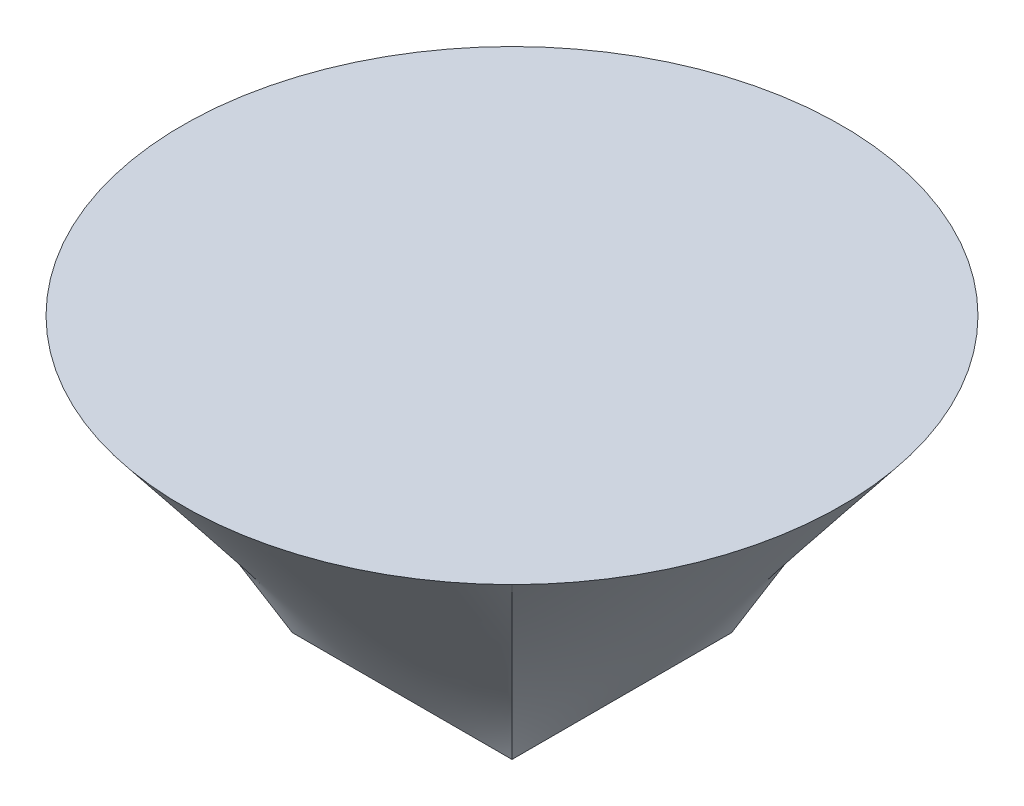
ISO-10303-21;
HEADER;
FILE_DESCRIPTION(('STEP AP214'),'2;1');
FILE_NAME('part.step','',(''),(''),'','','');
FILE_SCHEMA(('AUTOMOTIVE_DESIGN { 1 0 10303 214 1 1 1 1 }'));
ENDSEC;
DATA;
#1=APPLICATION_CONTEXT('core data for automotive mechanical design processes');
#2=APPLICATION_PROTOCOL_DEFINITION('international standard','automotive_design',2000,#1);
#3=PRODUCT_CONTEXT('',#1,'mechanical');
#4=PRODUCT('Part','Part','',(#3));
#5=PRODUCT_RELATED_PRODUCT_CATEGORY('part','',(#4));
#6=PRODUCT_DEFINITION_FORMATION('','',#4);
#7=PRODUCT_DEFINITION_CONTEXT('part definition',#1,'design');
#8=PRODUCT_DEFINITION('design','',#6,#7);
#9=PRODUCT_DEFINITION_SHAPE('','',#8);
#10=(LENGTH_UNIT() NAMED_UNIT(*) SI_UNIT(.MILLI.,.METRE.));
#11=(NAMED_UNIT(*) PLANE_ANGLE_UNIT() SI_UNIT($,.RADIAN.));
#12=(NAMED_UNIT(*) SI_UNIT($,.STERADIAN.) SOLID_ANGLE_UNIT());
#13=UNCERTAINTY_MEASURE_WITH_UNIT(LENGTH_MEASURE(1.E-05),#10,'distance_accuracy_value','');
#14=(GEOMETRIC_REPRESENTATION_CONTEXT(3) GLOBAL_UNCERTAINTY_ASSIGNED_CONTEXT((#13)) GLOBAL_UNIT_ASSIGNED_CONTEXT((#10,
#11,#12)) REPRESENTATION_CONTEXT('',''));
#15=CARTESIAN_POINT('',(0.,0.,0.));
#16=DIRECTION('',(0.,0.,1.));
#17=DIRECTION('',(1.,0.,0.));
#18=AXIS2_PLACEMENT_3D('',#15,#16,#17);
#19=CARTESIAN_POINT('',(0.,50.,0.));
#20=DIRECTION('',(0.,1.,0.));
#21=DIRECTION('',(0.,0.,1.));
#22=AXIS2_PLACEMENT_3D('',#19,#20,#21);
#23=PLANE('',#22);
#24=CARTESIAN_POINT('',(0.,50.,0.));
#25=DIRECTION('',(0.,1.,0.));
#26=DIRECTION('',(0.,0.,1.));
#27=AXIS2_PLACEMENT_3D('',#24,#25,#26);
#28=CIRCLE('',#27,60.);
#29=CARTESIAN_POINT('',(-42.4264068711928,50.,-42.4264068711929));
#30=VERTEX_POINT('',#29);
#31=CARTESIAN_POINT('',(-42.4264068711929,50.,42.4264068711928));
#32=VERTEX_POINT('',#31);
#33=EDGE_CURVE('E12',#30,#32,#28,.T.);
#34=ORIENTED_EDGE('',*,*,#33,.T.);
#35=CARTESIAN_POINT('',(42.4264068711929,50.,42.4264068711929));
#36=VERTEX_POINT('',#35);
#37=EDGE_CURVE('E81',#32,#36,#28,.T.);
#38=ORIENTED_EDGE('',*,*,#37,.T.);
#39=CARTESIAN_POINT('',(42.4264068711929,50.,-42.4264068711929));
#40=VERTEX_POINT('',#39);
#41=EDGE_CURVE('E147',#36,#40,#28,.T.);
#42=ORIENTED_EDGE('',*,*,#41,.T.);
#43=EDGE_CURVE('E145',#40,#30,#28,.T.);
#44=ORIENTED_EDGE('',*,*,#43,.T.);
#45=EDGE_LOOP('',(#34,#38,#42,#44));
#46=FACE_BOUND('',#45,.T.);
#47=ADVANCED_FACE('F71',(#46),#23,.T.);
#48=CARTESIAN_POINT('',(0.,0.,0.));
#49=DIRECTION('',(0.,-1.,0.));
#50=DIRECTION('',(0.,0.,-1.));
#51=AXIS2_PLACEMENT_3D('',#48,#49,#50);
#52=PLANE('',#51);
#53=DIRECTION('',(0.,0.,-1.));
#54=VECTOR('',#53,1.);
#55=CARTESIAN_POINT('',(20.,0.,20.));
#56=LINE('',#55,#54);
#57=CARTESIAN_POINT('',(20.,0.,20.));
#58=VERTEX_POINT('',#57);
#59=CARTESIAN_POINT('',(20.,0.,-20.));
#60=VERTEX_POINT('',#59);
#61=EDGE_CURVE('E139',#58,#60,#56,.T.);
#62=ORIENTED_EDGE('',*,*,#61,.F.);
#63=DIRECTION('',(1.,0.,0.));
#64=VECTOR('',#63,1.);
#65=CARTESIAN_POINT('',(-20.,0.,20.));
#66=LINE('',#65,#64);
#67=CARTESIAN_POINT('',(-20.,0.,20.));
#68=VERTEX_POINT('',#67);
#69=EDGE_CURVE('E121',#68,#58,#66,.T.);
#70=ORIENTED_EDGE('',*,*,#69,.F.);
#71=DIRECTION('',(0.,0.,1.));
#72=VECTOR('',#71,1.);
#73=CARTESIAN_POINT('',(-20.,0.,20.));
#74=LINE('',#73,#72);
#75=CARTESIAN_POINT('',(-20.,0.,-20.));
#76=VERTEX_POINT('',#75);
#77=EDGE_CURVE('E112',#76,#68,#74,.T.);
#78=ORIENTED_EDGE('',*,*,#77,.F.);
#79=DIRECTION('',(-1.,0.,0.));
#80=VECTOR('',#79,1.);
#81=CARTESIAN_POINT('',(-20.,0.,-20.));
#82=LINE('',#81,#80);
#83=EDGE_CURVE('E117',#60,#76,#82,.T.);
#84=ORIENTED_EDGE('',*,*,#83,.F.);
#85=EDGE_LOOP('',(#62,#70,#78,#84));
#86=FACE_BOUND('',#85,.T.);
#87=ADVANCED_FACE('F116',(#86),#52,.T.);
#88=CARTESIAN_POINT('',(-20.,0.,20.));
#89=CARTESIAN_POINT('',(-42.4264068711929,50.,42.4264068711928));
#90=CARTESIAN_POINT('',(-18.3333333333333,0.,20.));
#91=CARTESIAN_POINT('',(-39.9264068711929,50.,44.9264068711928));
#92=CARTESIAN_POINT('',(-16.6666666666667,0.,20.));
#93=CARTESIAN_POINT('',(-37.1106714589536,50.,47.2976537781671));
#94=CARTESIAN_POINT('',(-13.3333333333333,0.,20.));
#95=CARTESIAN_POINT('',(-30.8854788248622,50.,51.5786504942961));
#96=CARTESIAN_POINT('',(-11.6666666666667,0.,20.));
#97=CARTESIAN_POINT('',(-27.4757036978699,50.,53.4870142262914));
#98=CARTESIAN_POINT('',(-8.33333333333336,0.,20.));
#99=CARTESIAN_POINT('',(-20.1855780020187,50.,56.6420111336194));
#100=CARTESIAN_POINT('',(-6.66666666666669,0.,20.));
#101=CARTESIAN_POINT('',(-16.3057981833248,50.,57.8870978948963));
#102=CARTESIAN_POINT('',(-3.33333333333336,0.,20.));
#103=CARTESIAN_POINT('',(-8.28333875131798,50.,59.5666136037591));
#104=CARTESIAN_POINT('',(-1.66666666666669,0.,20.));
#105=CARTESIAN_POINT('',(-4.14213562373096,50.,60.));
#106=CARTESIAN_POINT('',(1.66666666666664,0.,20.));
#107=CARTESIAN_POINT('',(4.14213562373094,50.,60.));
#108=CARTESIAN_POINT('',(3.33333333333331,0.,20.));
#109=CARTESIAN_POINT('',(8.28333875131797,50.,59.5666136037591));
#110=CARTESIAN_POINT('',(6.66666666666664,0.,20.));
#111=CARTESIAN_POINT('',(16.3057981833248,50.,57.8870978948963));
#112=CARTESIAN_POINT('',(8.33333333333331,0.,20.));
#113=CARTESIAN_POINT('',(20.1855780020186,50.,56.6420111336194));
#114=CARTESIAN_POINT('',(11.6666666666666,0.,20.));
#115=CARTESIAN_POINT('',(27.4757036978699,50.,53.4870142262914));
#116=CARTESIAN_POINT('',(13.3333333333333,0.,20.));
#117=CARTESIAN_POINT('',(30.8854788248622,50.,51.5786504942961));
#118=CARTESIAN_POINT('',(16.6666666666667,0.,20.));
#119=CARTESIAN_POINT('',(37.1106714589536,50.,47.2976537781671));
#120=CARTESIAN_POINT('',(18.3333333333333,0.,20.));
#121=CARTESIAN_POINT('',(39.9264068711929,50.,44.9264068711929));
#122=CARTESIAN_POINT('',(20.,0.,20.));
#123=CARTESIAN_POINT('',(42.4264068711929,50.,42.4264068711929));
#124=B_SPLINE_SURFACE_WITH_KNOTS('',3,1,((#88,#89),(#90,#91),(#92,#93),(#94,#95),(#96,#97),(#98,
#99),(#100,#101),(#102,#103),(#104,#105),(#106,#107),(#108,#109),(#110,#111),(#112,#113),(#114,
#115),(#116,#117),(#118,#119),(#120,#121),(#122,#123)),.UNSPECIFIED.,.F.,.F.,.F.,(4,2,2,2,2,2,2,
2,4),(2,2),(0.,0.125,0.25,0.375,0.5,0.625,0.75,0.875,1.),(0.,1.),.UNSPECIFIED.);
#125=DIRECTION('',(0.378757038526448,0.844444321156433,0.378757038526448));
#126=VECTOR('',#125,1.);
#127=CARTESIAN_POINT('',(31.2132034355964,25.,31.2132034355964));
#128=LINE('',#127,#126);
#129=EDGE_CURVE('E149',#58,#36,#128,.T.);
#130=DIRECTION('',(0.378757038526448,-0.844444321156433,-0.378757038526448));
#131=VECTOR('',#130,1.);
#132=CARTESIAN_POINT('',(-31.2132034355964,25.,31.2132034355964));
#133=LINE('',#132,#131);
#134=EDGE_CURVE('E244',#32,#68,#133,.T.);
#135=ORIENTED_EDGE('',*,*,#69,.T.);
#136=ORIENTED_EDGE('',*,*,#129,.T.);
#137=ORIENTED_EDGE('',*,*,#37,.F.);
#138=ORIENTED_EDGE('',*,*,#134,.T.);
#139=EDGE_LOOP('',(#135,#136,#137,#138));
#140=FACE_BOUND('',#139,.T.);
#141=ADVANCED_FACE('F251',(#140),#124,.T.);
#142=CARTESIAN_POINT('',(20.,0.,20.));
#143=CARTESIAN_POINT('',(42.4264068711929,50.,42.4264068711929));
#144=CARTESIAN_POINT('',(20.,0.,18.3333333333333));
#145=CARTESIAN_POINT('',(44.9264068711929,50.,39.9264068711929));
#146=CARTESIAN_POINT('',(20.,0.,16.6666666666667));
#147=CARTESIAN_POINT('',(47.2976537781672,50.,37.1106714589536));
#148=CARTESIAN_POINT('',(20.,0.,13.3333333333333));
#149=CARTESIAN_POINT('',(51.5786504942961,50.,30.8854788248622));
#150=CARTESIAN_POINT('',(20.,0.,11.6666666666667));
#151=CARTESIAN_POINT('',(53.4870142262914,50.,27.4757036978699));
#152=CARTESIAN_POINT('',(20.,0.,8.33333333333334));
#153=CARTESIAN_POINT('',(56.6420111336194,50.,20.1855780020186));
#154=CARTESIAN_POINT('',(20.,0.,6.66666666666667));
#155=CARTESIAN_POINT('',(57.8870978948963,50.,16.3057981833248));
#156=CARTESIAN_POINT('',(20.,0.,3.33333333333334));
#157=CARTESIAN_POINT('',(59.5666136037591,50.,8.28333875131798));
#158=CARTESIAN_POINT('',(20.,0.,1.66666666666667));
#159=CARTESIAN_POINT('',(60.,50.,4.14213562373095));
#160=CARTESIAN_POINT('',(20.,0.,-1.66666666666666));
#161=CARTESIAN_POINT('',(60.,50.,-4.14213562373095));
#162=CARTESIAN_POINT('',(20.,0.,-3.33333333333333));
#163=CARTESIAN_POINT('',(59.5666136037591,50.,-8.28333875131797));
#164=CARTESIAN_POINT('',(20.,0.,-6.66666666666666));
#165=CARTESIAN_POINT('',(57.8870978948963,50.,-16.3057981833248));
#166=CARTESIAN_POINT('',(20.,0.,-8.33333333333333));
#167=CARTESIAN_POINT('',(56.6420111336194,50.,-20.1855780020186));
#168=CARTESIAN_POINT('',(20.,0.,-11.6666666666667));
#169=CARTESIAN_POINT('',(53.4870142262914,50.,-27.4757036978699));
#170=CARTESIAN_POINT('',(20.,0.,-13.3333333333333));
#171=CARTESIAN_POINT('',(51.5786504942961,50.,-30.8854788248622));
#172=CARTESIAN_POINT('',(20.,0.,-16.6666666666667));
#173=CARTESIAN_POINT('',(47.2976537781672,50.,-37.1106714589536));
#174=CARTESIAN_POINT('',(20.,0.,-18.3333333333333));
#175=CARTESIAN_POINT('',(44.9264068711929,50.,-39.9264068711929));
#176=CARTESIAN_POINT('',(20.,0.,-20.));
#177=CARTESIAN_POINT('',(42.4264068711929,50.,-42.4264068711929));
#178=B_SPLINE_SURFACE_WITH_KNOTS('',3,1,((#142,#143),(#144,#145),(#146,#147),(#148,#149),(#150,
#151),(#152,#153),(#154,#155),(#156,#157),(#158,#159),(#160,#161),(#162,#163),(#164,#165),(#166,
#167),(#168,#169),(#170,#171),(#172,#173),(#174,#175),(#176,#177)),.UNSPECIFIED.,.F.,.F.,.F.,(4,
2,2,2,2,2,2,2,4),(2,2),(0.,0.125,0.25,0.375,0.5,0.625,0.75,0.875,1.),(0.,1.),.UNSPECIFIED.);
#179=DIRECTION('',(0.378757038526448,0.844444321156433,-0.378757038526448));
#180=VECTOR('',#179,1.);
#181=CARTESIAN_POINT('',(31.2132034355964,25.,-31.2132034355964));
#182=LINE('',#181,#180);
#183=EDGE_CURVE('E138',#60,#40,#182,.T.);
#184=ORIENTED_EDGE('',*,*,#61,.T.);
#185=ORIENTED_EDGE('',*,*,#183,.T.);
#186=ORIENTED_EDGE('',*,*,#41,.F.);
#187=ORIENTED_EDGE('',*,*,#129,.F.);
#188=EDGE_LOOP('',(#184,#185,#186,#187));
#189=FACE_BOUND('',#188,.T.);
#190=ADVANCED_FACE('F171',(#189),#178,.T.);
#191=CARTESIAN_POINT('',(-20.,0.,-20.));
#192=CARTESIAN_POINT('',(-42.4264068711929,50.,-42.4264068711929));
#193=CARTESIAN_POINT('',(-20.,0.,-18.3333333333333));
#194=CARTESIAN_POINT('',(-44.9264068711929,50.,-39.9264068711929));
#195=CARTESIAN_POINT('',(-20.,0.,-16.6666666666667));
#196=CARTESIAN_POINT('',(-47.2976537781672,50.,-37.1106714589537));
#197=CARTESIAN_POINT('',(-20.,0.,-13.3333333333333));
#198=CARTESIAN_POINT('',(-51.5786504942961,50.,-30.8854788248622));
#199=CARTESIAN_POINT('',(-20.,0.,-11.6666666666666));
#200=CARTESIAN_POINT('',(-53.4870142262914,50.,-27.4757036978699));
#201=CARTESIAN_POINT('',(-20.,0.,-8.3333333333333));
#202=CARTESIAN_POINT('',(-56.6420111336194,50.,-20.1855780020187));
#203=CARTESIAN_POINT('',(-20.,0.,-6.66666666666663));
#204=CARTESIAN_POINT('',(-57.8870978948963,50.,-16.3057981833248));
#205=CARTESIAN_POINT('',(-20.,0.,-3.3333333333333));
#206=CARTESIAN_POINT('',(-59.5666136037591,50.,-8.28333875131799));
#207=CARTESIAN_POINT('',(-20.,0.,-1.66666666666663));
#208=CARTESIAN_POINT('',(-60.,50.,-4.14213562373096));
#209=CARTESIAN_POINT('',(-20.,0.,1.6666666666667));
#210=CARTESIAN_POINT('',(-60.,50.,4.14213562373094));
#211=CARTESIAN_POINT('',(-20.,0.,3.33333333333337));
#212=CARTESIAN_POINT('',(-59.5666136037591,50.,8.28333875131796));
#213=CARTESIAN_POINT('',(-20.,0.,6.66666666666671));
#214=CARTESIAN_POINT('',(-57.8870978948963,50.,16.3057981833248));
#215=CARTESIAN_POINT('',(-20.,0.,8.33333333333337));
#216=CARTESIAN_POINT('',(-56.6420111336194,50.,20.1855780020186));
#217=CARTESIAN_POINT('',(-20.,0.,11.6666666666667));
#218=CARTESIAN_POINT('',(-53.4870142262914,50.,27.4757036978698));
#219=CARTESIAN_POINT('',(-20.,0.,13.3333333333334));
#220=CARTESIAN_POINT('',(-51.5786504942961,50.,30.8854788248622));
#221=CARTESIAN_POINT('',(-20.,0.,16.6666666666667));
#222=CARTESIAN_POINT('',(-47.2976537781672,50.,37.1106714589536));
#223=CARTESIAN_POINT('',(-20.,0.,18.3333333333333));
#224=CARTESIAN_POINT('',(-44.9264068711929,50.,39.9264068711929));
#225=CARTESIAN_POINT('',(-20.,0.,20.));
#226=CARTESIAN_POINT('',(-42.4264068711929,50.,42.4264068711929));
#227=B_SPLINE_SURFACE_WITH_KNOTS('',3,1,((#191,#192),(#193,#194),(#195,#196),(#197,#198),(#199,
#200),(#201,#202),(#203,#204),(#205,#206),(#207,#208),(#209,#210),(#211,#212),(#213,#214),(#215,
#216),(#217,#218),(#219,#220),(#221,#222),(#223,#224),(#225,#226)),.UNSPECIFIED.,.F.,.F.,.F.,(4,
2,2,2,2,2,2,2,4),(2,2),(0.,0.125,0.25,0.375,0.5,0.625,0.75,0.875,1.),(0.,1.),.UNSPECIFIED.);
#228=DIRECTION('',(-0.378757038526448,0.844444321156433,-0.378757038526449));
#229=VECTOR('',#228,1.);
#230=CARTESIAN_POINT('',(-31.2132034355964,25.,-31.2132034355964));
#231=LINE('',#230,#229);
#232=EDGE_CURVE('E136',#76,#30,#231,.T.);
#233=ORIENTED_EDGE('',*,*,#77,.T.);
#234=ORIENTED_EDGE('',*,*,#134,.F.);
#235=ORIENTED_EDGE('',*,*,#33,.F.);
#236=ORIENTED_EDGE('',*,*,#232,.F.);
#237=EDGE_LOOP('',(#233,#234,#235,#236));
#238=FACE_BOUND('',#237,.T.);
#239=ADVANCED_FACE('F143',(#238),#227,.T.);
#240=CARTESIAN_POINT('',(20.,0.,-20.));
#241=CARTESIAN_POINT('',(42.4264068711929,50.,-42.4264068711929));
#242=CARTESIAN_POINT('',(18.3333333333333,0.,-20.));
#243=CARTESIAN_POINT('',(39.9264068711929,50.,-44.9264068711928));
#244=CARTESIAN_POINT('',(16.6666666666667,0.,-20.));
#245=CARTESIAN_POINT('',(37.1106714589536,50.,-47.2976537781671));
#246=CARTESIAN_POINT('',(13.3333333333333,0.,-20.));
#247=CARTESIAN_POINT('',(30.8854788248622,50.,-51.5786504942961));
#248=CARTESIAN_POINT('',(11.6666666666666,0.,-20.));
#249=CARTESIAN_POINT('',(27.4757036978699,50.,-53.4870142262914));
#250=CARTESIAN_POINT('',(8.33333333333331,0.,-20.));
#251=CARTESIAN_POINT('',(20.1855780020186,50.,-56.6420111336194));
#252=CARTESIAN_POINT('',(6.66666666666664,0.,-20.));
#253=CARTESIAN_POINT('',(16.3057981833248,50.,-57.8870978948963));
#254=CARTESIAN_POINT('',(3.33333333333331,0.,-20.));
#255=CARTESIAN_POINT('',(8.28333875131798,50.,-59.5666136037591));
#256=CARTESIAN_POINT('',(1.66666666666665,0.,-20.));
#257=CARTESIAN_POINT('',(4.14213562373096,50.,-60.));
#258=CARTESIAN_POINT('',(-1.66666666666669,0.,-20.));
#259=CARTESIAN_POINT('',(-4.14213562373094,50.,-60.));
#260=CARTESIAN_POINT('',(-3.33333333333336,0.,-20.));
#261=CARTESIAN_POINT('',(-8.28333875131797,50.,-59.5666136037592));
#262=CARTESIAN_POINT('',(-6.66666666666669,0.,-20.));
#263=CARTESIAN_POINT('',(-16.3057981833248,50.,-57.8870978948963));
#264=CARTESIAN_POINT('',(-8.33333333333336,0.,-20.));
#265=CARTESIAN_POINT('',(-20.1855780020186,50.,-56.6420111336194));
#266=CARTESIAN_POINT('',(-11.6666666666667,0.,-20.));
#267=CARTESIAN_POINT('',(-27.4757036978699,50.,-53.4870142262914));
#268=CARTESIAN_POINT('',(-13.3333333333334,0.,-20.));
#269=CARTESIAN_POINT('',(-30.8854788248622,50.,-51.5786504942961));
#270=CARTESIAN_POINT('',(-16.6666666666667,0.,-20.));
#271=CARTESIAN_POINT('',(-37.1106714589536,50.,-47.2976537781672));
#272=CARTESIAN_POINT('',(-18.3333333333333,0.,-20.));
#273=CARTESIAN_POINT('',(-39.9264068711928,50.,-44.9264068711928));
#274=CARTESIAN_POINT('',(-20.,0.,-20.));
#275=CARTESIAN_POINT('',(-42.4264068711929,50.,-42.4264068711929));
#276=B_SPLINE_SURFACE_WITH_KNOTS('',3,1,((#240,#241),(#242,#243),(#244,#245),(#246,#247),(#248,
#249),(#250,#251),(#252,#253),(#254,#255),(#256,#257),(#258,#259),(#260,#261),(#262,#263),(#264,
#265),(#266,#267),(#268,#269),(#270,#271),(#272,#273),(#274,#275)),.UNSPECIFIED.,.F.,.F.,.F.,(4,
2,2,2,2,2,2,2,4),(2,2),(0.,0.125,0.25,0.375,0.5,0.625,0.75,0.875,1.),(0.,1.),.UNSPECIFIED.);
#277=ORIENTED_EDGE('',*,*,#83,.T.);
#278=ORIENTED_EDGE('',*,*,#232,.T.);
#279=ORIENTED_EDGE('',*,*,#43,.F.);
#280=ORIENTED_EDGE('',*,*,#183,.F.);
#281=EDGE_LOOP('',(#277,#278,#279,#280));
#282=FACE_BOUND('',#281,.T.);
#283=ADVANCED_FACE('F134',(#282),#276,.T.);
#284=CLOSED_SHELL('',(#47,#87,#141,#190,#239,#283));
#285=MANIFOLD_SOLID_BREP('B2',#284);
#286=ADVANCED_BREP_SHAPE_REPRESENTATION('',(#18,#285),#14);
#287=SHAPE_DEFINITION_REPRESENTATION(#9,#286);
ENDSEC;
END-ISO-10303-21;
